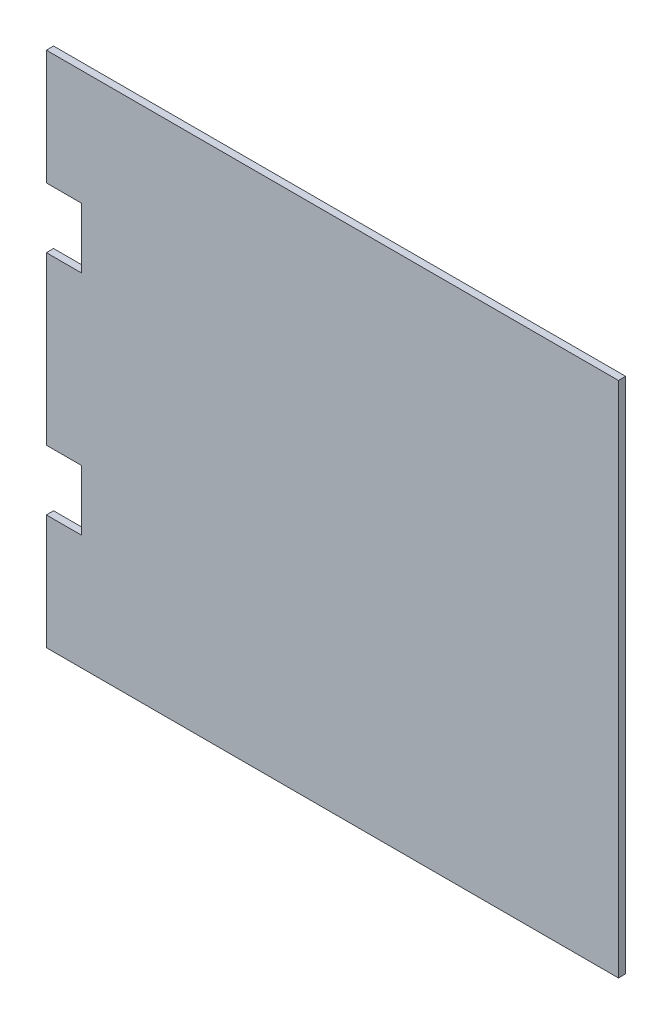
ISO-10303-21;
HEADER;
FILE_DESCRIPTION(('STEP AP214'),'2;1');
FILE_NAME('part.step','',(''),(''),'','','');
FILE_SCHEMA(('AUTOMOTIVE_DESIGN { 1 0 10303 214 1 1 1 1 }'));
ENDSEC;
DATA;
#1=APPLICATION_CONTEXT('core data for automotive mechanical design processes');
#2=APPLICATION_PROTOCOL_DEFINITION('international standard','automotive_design',2000,#1);
#3=PRODUCT_CONTEXT('',#1,'mechanical');
#4=PRODUCT('Part','Part','',(#3));
#5=PRODUCT_RELATED_PRODUCT_CATEGORY('part','',(#4));
#6=PRODUCT_DEFINITION_FORMATION('','',#4);
#7=PRODUCT_DEFINITION_CONTEXT('part definition',#1,'design');
#8=PRODUCT_DEFINITION('design','',#6,#7);
#9=PRODUCT_DEFINITION_SHAPE('','',#8);
#10=(LENGTH_UNIT() NAMED_UNIT(*) SI_UNIT(.MILLI.,.METRE.));
#11=(NAMED_UNIT(*) PLANE_ANGLE_UNIT() SI_UNIT($,.RADIAN.));
#12=(NAMED_UNIT(*) SI_UNIT($,.STERADIAN.) SOLID_ANGLE_UNIT());
#13=UNCERTAINTY_MEASURE_WITH_UNIT(LENGTH_MEASURE(1.E-05),#10,'distance_accuracy_value','');
#14=(GEOMETRIC_REPRESENTATION_CONTEXT(3) GLOBAL_UNCERTAINTY_ASSIGNED_CONTEXT((#13)) GLOBAL_UNIT_ASSIGNED_CONTEXT((#10,
#11,#12)) REPRESENTATION_CONTEXT('',''));
#15=CARTESIAN_POINT('',(0.,0.,0.));
#16=DIRECTION('',(0.,0.,1.));
#17=DIRECTION('',(1.,0.,0.));
#18=AXIS2_PLACEMENT_3D('',#15,#16,#17);
#19=CARTESIAN_POINT('',(0.,0.,5.));
#20=DIRECTION('',(0.,0.,1.));
#21=DIRECTION('',(1.,0.,0.));
#22=AXIS2_PLACEMENT_3D('',#19,#20,#21);
#23=PLANE('',#22);
#24=DIRECTION('',(-1.,0.,0.));
#25=VECTOR('',#24,1.);
#26=CARTESIAN_POINT('',(-173.560438041079,-100.,5.));
#27=LINE('',#26,#25);
#28=CARTESIAN_POINT('',(-173.560438041079,-100.,5.));
#29=VERTEX_POINT('',#28);
#30=CARTESIAN_POINT('',(-198.,-99.9999999999999,5.));
#31=VERTEX_POINT('',#30);
#32=EDGE_CURVE('E172',#29,#31,#27,.T.);
#33=ORIENTED_EDGE('',*,*,#32,.T.);
#34=DIRECTION('',(0.,1.,0.));
#35=VECTOR('',#34,1.);
#36=CARTESIAN_POINT('',(-198.,-180.,5.));
#37=LINE('',#36,#35);
#38=CARTESIAN_POINT('',(-198.,-180.,5.));
#39=VERTEX_POINT('',#38);
#40=EDGE_CURVE('E51',#39,#31,#37,.T.);
#41=ORIENTED_EDGE('',*,*,#40,.F.);
#42=DIRECTION('',(1.,0.,0.));
#43=VECTOR('',#42,1.);
#44=CARTESIAN_POINT('',(-200.,-180.,5.));
#45=LINE('',#44,#43);
#46=CARTESIAN_POINT('',(200.,-180.,5.));
#47=VERTEX_POINT('',#46);
#48=EDGE_CURVE('E158',#39,#47,#45,.T.);
#49=ORIENTED_EDGE('',*,*,#48,.T.);
#50=DIRECTION('',(0.,1.,0.));
#51=VECTOR('',#50,1.);
#52=CARTESIAN_POINT('',(200.,180.,5.));
#53=LINE('',#52,#51);
#54=CARTESIAN_POINT('',(200.,180.,5.));
#55=VERTEX_POINT('',#54);
#56=EDGE_CURVE('E152',#47,#55,#53,.T.);
#57=ORIENTED_EDGE('',*,*,#56,.T.);
#58=DIRECTION('',(-1.,0.,0.));
#59=VECTOR('',#58,1.);
#60=CARTESIAN_POINT('',(-200.,180.,5.));
#61=LINE('',#60,#59);
#62=CARTESIAN_POINT('',(-198.,180.,5.));
#63=VERTEX_POINT('',#62);
#64=EDGE_CURVE('E162',#55,#63,#61,.T.);
#65=ORIENTED_EDGE('',*,*,#64,.T.);
#66=DIRECTION('',(0.,1.,0.));
#67=VECTOR('',#66,1.);
#68=CARTESIAN_POINT('',(-198.,100.,5.));
#69=LINE('',#68,#67);
#70=CARTESIAN_POINT('',(-198.,100.,5.));
#71=VERTEX_POINT('',#70);
#72=EDGE_CURVE('E130',#71,#63,#69,.T.);
#73=ORIENTED_EDGE('',*,*,#72,.F.);
#74=DIRECTION('',(-1.,0.,0.));
#75=VECTOR('',#74,1.);
#76=CARTESIAN_POINT('',(-173.560438041079,100.,5.));
#77=LINE('',#76,#75);
#78=CARTESIAN_POINT('',(-173.560438041079,100.,5.));
#79=VERTEX_POINT('',#78);
#80=EDGE_CURVE('E201',#79,#71,#77,.T.);
#81=ORIENTED_EDGE('',*,*,#80,.F.);
#82=DIRECTION('',(0.,-1.,0.));
#83=VECTOR('',#82,1.);
#84=CARTESIAN_POINT('',(-173.560438041079,100.,5.));
#85=LINE('',#84,#83);
#86=CARTESIAN_POINT('',(-173.560438041079,58.,5.));
#87=VERTEX_POINT('',#86);
#88=EDGE_CURVE('E197',#79,#87,#85,.T.);
#89=ORIENTED_EDGE('',*,*,#88,.T.);
#90=DIRECTION('',(-1.,0.,0.));
#91=VECTOR('',#90,1.);
#92=CARTESIAN_POINT('',(-173.560438041079,58.,5.));
#93=LINE('',#92,#91);
#94=CARTESIAN_POINT('',(-198.,58.,5.));
#95=VERTEX_POINT('',#94);
#96=EDGE_CURVE('E183',#87,#95,#93,.T.);
#97=ORIENTED_EDGE('',*,*,#96,.T.);
#98=DIRECTION('',(0.,1.,0.));
#99=VECTOR('',#98,1.);
#100=CARTESIAN_POINT('',(-198.,-57.9999999999999,5.));
#101=LINE('',#100,#99);
#102=CARTESIAN_POINT('',(-198.,-57.9999999999999,5.));
#103=VERTEX_POINT('',#102);
#104=EDGE_CURVE('E59',#103,#95,#101,.T.);
#105=ORIENTED_EDGE('',*,*,#104,.F.);
#106=DIRECTION('',(-1.,0.,0.));
#107=VECTOR('',#106,1.);
#108=CARTESIAN_POINT('',(-173.560438041079,-58.,5.));
#109=LINE('',#108,#107);
#110=CARTESIAN_POINT('',(-173.560438041079,-58.,5.));
#111=VERTEX_POINT('',#110);
#112=EDGE_CURVE('E184',#111,#103,#109,.T.);
#113=ORIENTED_EDGE('',*,*,#112,.F.);
#114=DIRECTION('',(0.,1.,0.));
#115=VECTOR('',#114,1.);
#116=CARTESIAN_POINT('',(-173.560438041079,-100.,5.));
#117=LINE('',#116,#115);
#118=EDGE_CURVE('E180',#29,#111,#117,.T.);
#119=ORIENTED_EDGE('',*,*,#118,.F.);
#120=EDGE_LOOP('',(#33,#41,#49,#57,#65,#73,#81,#89,#97,#105,#113,#119));
#121=FACE_BOUND('',#120,.T.);
#122=ADVANCED_FACE('F36',(#121),#23,.T.);
#123=CARTESIAN_POINT('',(0.,0.,0.));
#124=DIRECTION('',(0.,0.,1.));
#125=DIRECTION('',(1.,0.,0.));
#126=AXIS2_PLACEMENT_3D('',#123,#124,#125);
#127=PLANE('',#126);
#128=DIRECTION('',(0.,-1.,0.));
#129=VECTOR('',#128,1.);
#130=CARTESIAN_POINT('',(-198.,-99.9999999999999,0.));
#131=LINE('',#130,#129);
#132=CARTESIAN_POINT('',(-198.,-99.9999999999999,0.));
#133=VERTEX_POINT('',#132);
#134=CARTESIAN_POINT('',(-198.,-180.,0.));
#135=VERTEX_POINT('',#134);
#136=EDGE_CURVE('E217',#133,#135,#131,.T.);
#137=ORIENTED_EDGE('',*,*,#136,.F.);
#138=DIRECTION('',(-1.,0.,0.));
#139=VECTOR('',#138,1.);
#140=CARTESIAN_POINT('',(-173.560438041079,-100.,0.));
#141=LINE('',#140,#139);
#142=CARTESIAN_POINT('',(-173.560438041079,-100.,0.));
#143=VERTEX_POINT('',#142);
#144=EDGE_CURVE('E176',#143,#133,#141,.T.);
#145=ORIENTED_EDGE('',*,*,#144,.F.);
#146=DIRECTION('',(0.,1.,0.));
#147=VECTOR('',#146,1.);
#148=CARTESIAN_POINT('',(-173.560438041079,-100.,0.));
#149=LINE('',#148,#147);
#150=CARTESIAN_POINT('',(-173.560438041079,-58.,0.));
#151=VERTEX_POINT('',#150);
#152=EDGE_CURVE('E169',#143,#151,#149,.T.);
#153=ORIENTED_EDGE('',*,*,#152,.T.);
#154=DIRECTION('',(-1.,0.,0.));
#155=VECTOR('',#154,1.);
#156=CARTESIAN_POINT('',(-173.560438041079,-58.,0.));
#157=LINE('',#156,#155);
#158=CARTESIAN_POINT('',(-198.,-57.9999999999999,0.));
#159=VERTEX_POINT('',#158);
#160=EDGE_CURVE('E173',#151,#159,#157,.T.);
#161=ORIENTED_EDGE('',*,*,#160,.T.);
#162=DIRECTION('',(0.,-1.,0.));
#163=VECTOR('',#162,1.);
#164=CARTESIAN_POINT('',(-198.,58.,0.));
#165=LINE('',#164,#163);
#166=CARTESIAN_POINT('',(-198.,58.,0.));
#167=VERTEX_POINT('',#166);
#168=EDGE_CURVE('E211',#167,#159,#165,.T.);
#169=ORIENTED_EDGE('',*,*,#168,.F.);
#170=DIRECTION('',(-1.,0.,0.));
#171=VECTOR('',#170,1.);
#172=CARTESIAN_POINT('',(-173.560438041079,58.,0.));
#173=LINE('',#172,#171);
#174=CARTESIAN_POINT('',(-173.560438041079,58.,0.));
#175=VERTEX_POINT('',#174);
#176=EDGE_CURVE('E200',#175,#167,#173,.T.);
#177=ORIENTED_EDGE('',*,*,#176,.F.);
#178=DIRECTION('',(0.,-1.,0.));
#179=VECTOR('',#178,1.);
#180=CARTESIAN_POINT('',(-173.560438041079,100.,0.));
#181=LINE('',#180,#179);
#182=CARTESIAN_POINT('',(-173.560438041079,100.,0.));
#183=VERTEX_POINT('',#182);
#184=EDGE_CURVE('E196',#183,#175,#181,.T.);
#185=ORIENTED_EDGE('',*,*,#184,.F.);
#186=DIRECTION('',(-1.,0.,0.));
#187=VECTOR('',#186,1.);
#188=CARTESIAN_POINT('',(-173.560438041079,100.,0.));
#189=LINE('',#188,#187);
#190=CARTESIAN_POINT('',(-198.,100.,0.));
#191=VERTEX_POINT('',#190);
#192=EDGE_CURVE('E143',#183,#191,#189,.T.);
#193=ORIENTED_EDGE('',*,*,#192,.T.);
#194=DIRECTION('',(0.,-1.,0.));
#195=VECTOR('',#194,1.);
#196=CARTESIAN_POINT('',(-198.,180.,0.));
#197=LINE('',#196,#195);
#198=CARTESIAN_POINT('',(-198.,180.,0.));
#199=VERTEX_POINT('',#198);
#200=EDGE_CURVE('E127',#199,#191,#197,.T.);
#201=ORIENTED_EDGE('',*,*,#200,.F.);
#202=DIRECTION('',(-1.,0.,0.));
#203=VECTOR('',#202,1.);
#204=CARTESIAN_POINT('',(-200.,180.,0.));
#205=LINE('',#204,#203);
#206=CARTESIAN_POINT('',(200.,180.,0.));
#207=VERTEX_POINT('',#206);
#208=EDGE_CURVE('E141',#207,#199,#205,.T.);
#209=ORIENTED_EDGE('',*,*,#208,.F.);
#210=DIRECTION('',(0.,1.,0.));
#211=VECTOR('',#210,1.);
#212=CARTESIAN_POINT('',(200.,180.,0.));
#213=LINE('',#212,#211);
#214=CARTESIAN_POINT('',(200.,-180.,0.));
#215=VERTEX_POINT('',#214);
#216=EDGE_CURVE('E150',#215,#207,#213,.T.);
#217=ORIENTED_EDGE('',*,*,#216,.F.);
#218=DIRECTION('',(1.,0.,0.));
#219=VECTOR('',#218,1.);
#220=CARTESIAN_POINT('',(-200.,-180.,0.));
#221=LINE('',#220,#219);
#222=EDGE_CURVE('E149',#135,#215,#221,.T.);
#223=ORIENTED_EDGE('',*,*,#222,.F.);
#224=EDGE_LOOP('',(#137,#145,#153,#161,#169,#177,#185,#193,#201,#209,#217,#223));
#225=FACE_BOUND('',#224,.T.);
#226=ADVANCED_FACE('F139',(#225),#127,.F.);
#227=CARTESIAN_POINT('',(-200.,180.,5.));
#228=DIRECTION('',(0.,-1.,0.));
#229=DIRECTION('',(0.,0.,-1.));
#230=AXIS2_PLACEMENT_3D('',#227,#228,#229);
#231=PLANE('',#230);
#232=DIRECTION('',(0.,0.,-1.));
#233=VECTOR('',#232,1.);
#234=CARTESIAN_POINT('',(-198.,180.,5.));
#235=LINE('',#234,#233);
#236=EDGE_CURVE('E124',#63,#199,#235,.T.);
#237=ORIENTED_EDGE('',*,*,#236,.F.);
#238=ORIENTED_EDGE('',*,*,#64,.F.);
#239=DIRECTION('',(0.,0.,-1.));
#240=VECTOR('',#239,1.);
#241=CARTESIAN_POINT('',(200.,180.,5.));
#242=LINE('',#241,#240);
#243=EDGE_CURVE('E11',#55,#207,#242,.T.);
#244=ORIENTED_EDGE('',*,*,#243,.T.);
#245=ORIENTED_EDGE('',*,*,#208,.T.);
#246=EDGE_LOOP('',(#237,#238,#244,#245));
#247=FACE_BOUND('',#246,.T.);
#248=ADVANCED_FACE('F146',(#247),#231,.F.);
#249=CARTESIAN_POINT('',(-200.,-180.,5.));
#250=DIRECTION('',(0.,1.,0.));
#251=DIRECTION('',(0.,0.,1.));
#252=AXIS2_PLACEMENT_3D('',#249,#250,#251);
#253=PLANE('',#252);
#254=DIRECTION('',(0.,0.,1.));
#255=VECTOR('',#254,1.);
#256=CARTESIAN_POINT('',(-198.,-180.,0.));
#257=LINE('',#256,#255);
#258=EDGE_CURVE('E134',#135,#39,#257,.T.);
#259=ORIENTED_EDGE('',*,*,#258,.F.);
#260=ORIENTED_EDGE('',*,*,#222,.T.);
#261=DIRECTION('',(0.,0.,-1.));
#262=VECTOR('',#261,1.);
#263=CARTESIAN_POINT('',(200.,-180.,5.));
#264=LINE('',#263,#262);
#265=EDGE_CURVE('E44',#47,#215,#264,.T.);
#266=ORIENTED_EDGE('',*,*,#265,.F.);
#267=ORIENTED_EDGE('',*,*,#48,.F.);
#268=EDGE_LOOP('',(#259,#260,#266,#267));
#269=FACE_BOUND('',#268,.T.);
#270=ADVANCED_FACE('F254',(#269),#253,.F.);
#271=CARTESIAN_POINT('',(-173.560438041079,-100.,0.));
#272=DIRECTION('',(0.,1.,0.));
#273=DIRECTION('',(-1.,0.,0.));
#274=AXIS2_PLACEMENT_3D('',#271,#272,#273);
#275=PLANE('',#274);
#276=ORIENTED_EDGE('',*,*,#144,.T.);
#277=DIRECTION('',(0.,0.,-1.));
#278=VECTOR('',#277,1.);
#279=CARTESIAN_POINT('',(-198.,-99.9999999999999,5.));
#280=LINE('',#279,#278);
#281=EDGE_CURVE('E219',#31,#133,#280,.T.);
#282=ORIENTED_EDGE('',*,*,#281,.F.);
#283=ORIENTED_EDGE('',*,*,#32,.F.);
#284=DIRECTION('',(0.,0.,1.));
#285=VECTOR('',#284,1.);
#286=CARTESIAN_POINT('',(-173.560438041079,-100.,0.));
#287=LINE('',#286,#285);
#288=EDGE_CURVE('E189',#143,#29,#287,.T.);
#289=ORIENTED_EDGE('',*,*,#288,.F.);
#290=EDGE_LOOP('',(#276,#282,#283,#289));
#291=FACE_BOUND('',#290,.T.);
#292=ADVANCED_FACE('F249',(#291),#275,.T.);
#293=CARTESIAN_POINT('',(-173.560438041079,-58.,0.));
#294=DIRECTION('',(0.,1.,0.));
#295=DIRECTION('',(-1.,0.,0.));
#296=AXIS2_PLACEMENT_3D('',#293,#294,#295);
#297=PLANE('',#296);
#298=DIRECTION('',(0.,0.,1.));
#299=VECTOR('',#298,1.);
#300=CARTESIAN_POINT('',(-198.,-57.9999999999999,0.));
#301=LINE('',#300,#299);
#302=EDGE_CURVE('E191',#159,#103,#301,.T.);
#303=ORIENTED_EDGE('',*,*,#302,.F.);
#304=ORIENTED_EDGE('',*,*,#160,.F.);
#305=DIRECTION('',(0.,0.,1.));
#306=VECTOR('',#305,1.);
#307=CARTESIAN_POINT('',(-173.560438041079,-58.,0.));
#308=LINE('',#307,#306);
#309=EDGE_CURVE('E179',#151,#111,#308,.T.);
#310=ORIENTED_EDGE('',*,*,#309,.T.);
#311=ORIENTED_EDGE('',*,*,#112,.T.);
#312=EDGE_LOOP('',(#303,#304,#310,#311));
#313=FACE_BOUND('',#312,.T.);
#314=ADVANCED_FACE('F243',(#313),#297,.F.);
#315=CARTESIAN_POINT('',(-173.560438041079,58.,0.));
#316=DIRECTION('',(0.,1.,0.));
#317=DIRECTION('',(0.,0.,1.));
#318=AXIS2_PLACEMENT_3D('',#315,#316,#317);
#319=PLANE('',#318);
#320=ORIENTED_EDGE('',*,*,#176,.T.);
#321=DIRECTION('',(0.,0.,-1.));
#322=VECTOR('',#321,1.);
#323=CARTESIAN_POINT('',(-198.,58.,5.));
#324=LINE('',#323,#322);
#325=EDGE_CURVE('E213',#95,#167,#324,.T.);
#326=ORIENTED_EDGE('',*,*,#325,.F.);
#327=ORIENTED_EDGE('',*,*,#96,.F.);
#328=DIRECTION('',(0.,0.,1.));
#329=VECTOR('',#328,1.);
#330=CARTESIAN_POINT('',(-173.560438041079,58.,0.));
#331=LINE('',#330,#329);
#332=EDGE_CURVE('E194',#175,#87,#331,.T.);
#333=ORIENTED_EDGE('',*,*,#332,.F.);
#334=EDGE_LOOP('',(#320,#326,#327,#333));
#335=FACE_BOUND('',#334,.T.);
#336=ADVANCED_FACE('F234',(#335),#319,.T.);
#337=CARTESIAN_POINT('',(-173.560438041079,100.,0.));
#338=DIRECTION('',(0.,1.,0.));
#339=DIRECTION('',(0.,0.,1.));
#340=AXIS2_PLACEMENT_3D('',#337,#338,#339);
#341=PLANE('',#340);
#342=DIRECTION('',(0.,0.,1.));
#343=VECTOR('',#342,1.);
#344=CARTESIAN_POINT('',(-198.,100.,0.));
#345=LINE('',#344,#343);
#346=EDGE_CURVE('E144',#191,#71,#345,.T.);
#347=ORIENTED_EDGE('',*,*,#346,.F.);
#348=ORIENTED_EDGE('',*,*,#192,.F.);
#349=DIRECTION('',(0.,0.,1.));
#350=VECTOR('',#349,1.);
#351=CARTESIAN_POINT('',(-173.560438041079,100.,0.));
#352=LINE('',#351,#350);
#353=EDGE_CURVE('E154',#183,#79,#352,.T.);
#354=ORIENTED_EDGE('',*,*,#353,.T.);
#355=ORIENTED_EDGE('',*,*,#80,.T.);
#356=EDGE_LOOP('',(#347,#348,#354,#355));
#357=FACE_BOUND('',#356,.T.);
#358=ADVANCED_FACE('F225',(#357),#341,.F.);
#359=CARTESIAN_POINT('',(200.,180.,5.));
#360=DIRECTION('',(-1.,0.,0.));
#361=DIRECTION('',(0.,-1.,0.));
#362=AXIS2_PLACEMENT_3D('',#359,#360,#361);
#363=PLANE('',#362);
#364=ORIENTED_EDGE('',*,*,#216,.T.);
#365=ORIENTED_EDGE('',*,*,#243,.F.);
#366=ORIENTED_EDGE('',*,*,#56,.F.);
#367=ORIENTED_EDGE('',*,*,#265,.T.);
#368=EDGE_LOOP('',(#364,#365,#366,#367));
#369=FACE_BOUND('',#368,.T.);
#370=ADVANCED_FACE('F38',(#369),#363,.F.);
#371=CARTESIAN_POINT('',(-173.560438041079,-100.,0.));
#372=DIRECTION('',(1.,0.,0.));
#373=DIRECTION('',(0.,0.,-1.));
#374=AXIS2_PLACEMENT_3D('',#371,#372,#373);
#375=PLANE('',#374);
#376=ORIENTED_EDGE('',*,*,#118,.T.);
#377=ORIENTED_EDGE('',*,*,#309,.F.);
#378=ORIENTED_EDGE('',*,*,#152,.F.);
#379=ORIENTED_EDGE('',*,*,#288,.T.);
#380=EDGE_LOOP('',(#376,#377,#378,#379));
#381=FACE_BOUND('',#380,.T.);
#382=ADVANCED_FACE('F247',(#381),#375,.F.);
#383=CARTESIAN_POINT('',(-173.560438041079,100.,0.));
#384=DIRECTION('',(-1.,0.,0.));
#385=DIRECTION('',(0.,0.,1.));
#386=AXIS2_PLACEMENT_3D('',#383,#384,#385);
#387=PLANE('',#386);
#388=ORIENTED_EDGE('',*,*,#88,.F.);
#389=ORIENTED_EDGE('',*,*,#353,.F.);
#390=ORIENTED_EDGE('',*,*,#184,.T.);
#391=ORIENTED_EDGE('',*,*,#332,.T.);
#392=EDGE_LOOP('',(#388,#389,#390,#391));
#393=FACE_BOUND('',#392,.T.);
#394=ADVANCED_FACE('F229',(#393),#387,.T.);
#395=CARTESIAN_POINT('',(-198.,0.,0.));
#396=DIRECTION('',(-1.,0.,0.));
#397=DIRECTION('',(0.,-1.,0.));
#398=AXIS2_PLACEMENT_3D('',#395,#396,#397);
#399=PLANE('',#398);
#400=ORIENTED_EDGE('',*,*,#236,.T.);
#401=ORIENTED_EDGE('',*,*,#200,.T.);
#402=ORIENTED_EDGE('',*,*,#346,.T.);
#403=ORIENTED_EDGE('',*,*,#72,.T.);
#404=EDGE_LOOP('',(#400,#401,#402,#403));
#405=FACE_BOUND('',#404,.T.);
#406=ADVANCED_FACE('F126',(#405),#399,.T.);
#407=CARTESIAN_POINT('',(-198.,0.,0.));
#408=DIRECTION('',(-1.,0.,0.));
#409=DIRECTION('',(0.,0.,1.));
#410=AXIS2_PLACEMENT_3D('',#407,#408,#409);
#411=PLANE('',#410);
#412=ORIENTED_EDGE('',*,*,#104,.T.);
#413=ORIENTED_EDGE('',*,*,#325,.T.);
#414=ORIENTED_EDGE('',*,*,#168,.T.);
#415=ORIENTED_EDGE('',*,*,#302,.T.);
#416=EDGE_LOOP('',(#412,#413,#414,#415));
#417=FACE_BOUND('',#416,.T.);
#418=ADVANCED_FACE('F237',(#417),#411,.T.);
#419=CARTESIAN_POINT('',(-198.,0.,0.));
#420=DIRECTION('',(-1.,0.,0.));
#421=DIRECTION('',(0.,0.,1.));
#422=AXIS2_PLACEMENT_3D('',#419,#420,#421);
#423=PLANE('',#422);
#424=ORIENTED_EDGE('',*,*,#40,.T.);
#425=ORIENTED_EDGE('',*,*,#281,.T.);
#426=ORIENTED_EDGE('',*,*,#136,.T.);
#427=ORIENTED_EDGE('',*,*,#258,.T.);
#428=EDGE_LOOP('',(#424,#425,#426,#427));
#429=FACE_BOUND('',#428,.T.);
#430=ADVANCED_FACE('F250',(#429),#423,.T.);
#431=CLOSED_SHELL('',(#122,#226,#248,#270,#292,#314,#336,#358,#370,#382,#394,#406,#418,#430));
#432=MANIFOLD_SOLID_BREP('B2',#431);
#433=ADVANCED_BREP_SHAPE_REPRESENTATION('',(#18,#432),#14);
#434=SHAPE_DEFINITION_REPRESENTATION(#9,#433);
ENDSEC;
END-ISO-10303-21;
